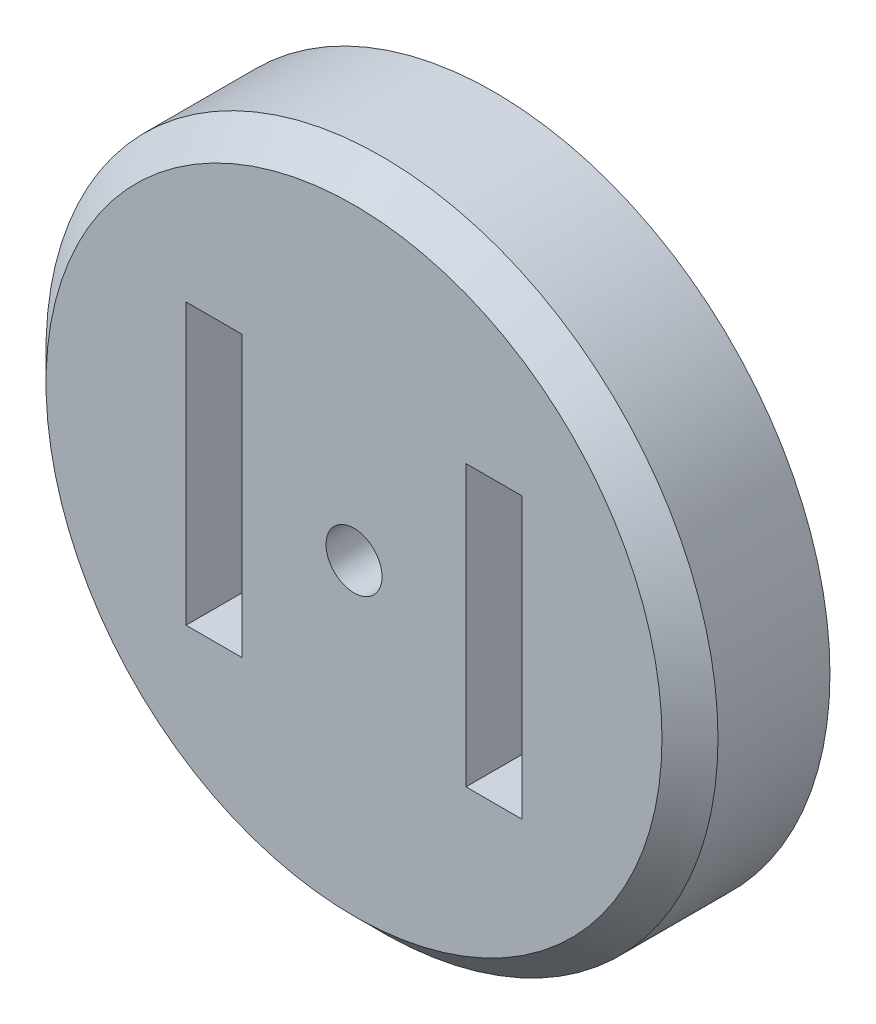
ISO-10303-21;
HEADER;
FILE_DESCRIPTION(('STEP AP214'),'2;1');
FILE_NAME('part.step','',(''),(''),'','','');
FILE_SCHEMA(('AUTOMOTIVE_DESIGN { 1 0 10303 214 1 1 1 1 }'));
ENDSEC;
DATA;
#1=APPLICATION_CONTEXT('core data for automotive mechanical design processes');
#2=APPLICATION_PROTOCOL_DEFINITION('international standard','automotive_design',2000,#1);
#3=PRODUCT_CONTEXT('',#1,'mechanical');
#4=PRODUCT('Part','Part','',(#3));
#5=PRODUCT_RELATED_PRODUCT_CATEGORY('part','',(#4));
#6=PRODUCT_DEFINITION_FORMATION('','',#4);
#7=PRODUCT_DEFINITION_CONTEXT('part definition',#1,'design');
#8=PRODUCT_DEFINITION('design','',#6,#7);
#9=PRODUCT_DEFINITION_SHAPE('','',#8);
#10=(LENGTH_UNIT() NAMED_UNIT(*) SI_UNIT(.MILLI.,.METRE.));
#11=(NAMED_UNIT(*) PLANE_ANGLE_UNIT() SI_UNIT($,.RADIAN.));
#12=(NAMED_UNIT(*) SI_UNIT($,.STERADIAN.) SOLID_ANGLE_UNIT());
#13=UNCERTAINTY_MEASURE_WITH_UNIT(LENGTH_MEASURE(1.E-05),#10,'distance_accuracy_value','');
#14=(GEOMETRIC_REPRESENTATION_CONTEXT(3) GLOBAL_UNCERTAINTY_ASSIGNED_CONTEXT((#13)) GLOBAL_UNIT_ASSIGNED_CONTEXT((#10,
#11,#12)) REPRESENTATION_CONTEXT('',''));
#15=CARTESIAN_POINT('',(0.,0.,0.));
#16=DIRECTION('',(0.,0.,1.));
#17=DIRECTION('',(1.,0.,0.));
#18=AXIS2_PLACEMENT_3D('',#15,#16,#17);
#19=CARTESIAN_POINT('',(0.,0.,0.));
#20=DIRECTION('',(0.,0.,1.));
#21=DIRECTION('',(1.,0.,0.));
#22=AXIS2_PLACEMENT_3D('',#19,#20,#21);
#23=CYLINDRICAL_SURFACE('',#22,5.);
#24=CARTESIAN_POINT('',(0.,0.,25.));
#25=DIRECTION('',(0.,0.,1.));
#26=DIRECTION('',(1.,0.,0.));
#27=AXIS2_PLACEMENT_3D('',#24,#25,#26);
#28=CIRCLE('',#27,5.);
#29=CARTESIAN_POINT('',(5.,0.,25.));
#30=VERTEX_POINT('',#29);
#31=EDGE_CURVE('E130',#30,#30,#28,.T.);
#32=ORIENTED_EDGE('',*,*,#31,.T.);
#33=EDGE_LOOP('',(#32));
#34=FACE_BOUND('',#33,.T.);
#35=CARTESIAN_POINT('',(0.,0.,4.));
#36=DIRECTION('',(0.,0.,-1.));
#37=DIRECTION('',(-1.,0.,0.));
#38=AXIS2_PLACEMENT_3D('',#35,#36,#37);
#39=CIRCLE('',#38,5.);
#40=CARTESIAN_POINT('',(-5.,0.,4.));
#41=VERTEX_POINT('',#40);
#42=EDGE_CURVE('E40',#41,#41,#39,.F.);
#43=ORIENTED_EDGE('',*,*,#42,.F.);
#44=EDGE_LOOP('',(#43));
#45=FACE_BOUND('',#44,.T.);
#46=ADVANCED_FACE('F35',(#34,#45),#23,.F.);
#47=CARTESIAN_POINT('',(0.,0.,25.));
#48=DIRECTION('',(0.,0.,-1.));
#49=DIRECTION('',(-1.,0.,0.));
#50=AXIS2_PLACEMENT_3D('',#47,#48,#49);
#51=CYLINDRICAL_SURFACE('',#50,60.);
#52=CARTESIAN_POINT('',(0.,0.,20.));
#53=DIRECTION('',(0.,0.,1.));
#54=DIRECTION('',(1.,0.,0.));
#55=AXIS2_PLACEMENT_3D('',#52,#53,#54);
#56=CIRCLE('',#55,60.);
#57=CARTESIAN_POINT('',(60.,0.,20.));
#58=VERTEX_POINT('',#57);
#59=EDGE_CURVE('E11',#58,#58,#56,.F.);
#60=ORIENTED_EDGE('',*,*,#59,.T.);
#61=EDGE_LOOP('',(#60));
#62=FACE_BOUND('',#61,.T.);
#63=CARTESIAN_POINT('',(0.,0.,0.));
#64=DIRECTION('',(0.,0.,1.));
#65=DIRECTION('',(1.,0.,0.));
#66=AXIS2_PLACEMENT_3D('',#63,#64,#65);
#67=CIRCLE('',#66,60.);
#68=CARTESIAN_POINT('',(60.,0.,0.));
#69=VERTEX_POINT('',#68);
#70=EDGE_CURVE('E174',#69,#69,#67,.T.);
#71=ORIENTED_EDGE('',*,*,#70,.T.);
#72=EDGE_LOOP('',(#71));
#73=FACE_BOUND('',#72,.T.);
#74=ADVANCED_FACE('F197',(#62,#73),#51,.T.);
#75=CARTESIAN_POINT('',(0.,0.,25.));
#76=DIRECTION('',(0.,0.,1.));
#77=DIRECTION('',(1.,0.,0.));
#78=AXIS2_PLACEMENT_3D('',#75,#76,#77);
#79=PLANE('',#78);
#80=ORIENTED_EDGE('',*,*,#31,.F.);
#81=EDGE_LOOP('',(#80));
#82=FACE_BOUND('',#81,.T.);
#83=CARTESIAN_POINT('',(0.,0.,25.));
#84=DIRECTION('',(0.,0.,1.));
#85=DIRECTION('',(1.,0.,0.));
#86=AXIS2_PLACEMENT_3D('',#83,#84,#85);
#87=CIRCLE('',#86,55.0000000000001);
#88=CARTESIAN_POINT('',(55.0000000000001,0.,25.));
#89=VERTEX_POINT('',#88);
#90=EDGE_CURVE('E45',#89,#89,#87,.T.);
#91=ORIENTED_EDGE('',*,*,#90,.T.);
#92=EDGE_LOOP('',(#91));
#93=FACE_BOUND('',#92,.T.);
#94=DIRECTION('',(0.,-1.,0.));
#95=VECTOR('',#94,1.);
#96=CARTESIAN_POINT('',(-30.,0.,25.));
#97=LINE('',#96,#95);
#98=CARTESIAN_POINT('',(-30.,25.,25.));
#99=VERTEX_POINT('',#98);
#100=CARTESIAN_POINT('',(-30.,-25.,25.));
#101=VERTEX_POINT('',#100);
#102=EDGE_CURVE('E107',#99,#101,#97,.T.);
#103=ORIENTED_EDGE('',*,*,#102,.F.);
#104=DIRECTION('',(-1.,0.,0.));
#105=VECTOR('',#104,1.);
#106=CARTESIAN_POINT('',(0.,25.,25.));
#107=LINE('',#106,#105);
#108=CARTESIAN_POINT('',(-20.,25.,25.));
#109=VERTEX_POINT('',#108);
#110=EDGE_CURVE('E171',#109,#99,#107,.T.);
#111=ORIENTED_EDGE('',*,*,#110,.F.);
#112=DIRECTION('',(0.,1.,0.));
#113=VECTOR('',#112,1.);
#114=CARTESIAN_POINT('',(-20.,0.,25.));
#115=LINE('',#114,#113);
#116=CARTESIAN_POINT('',(-20.,-25.,25.));
#117=VERTEX_POINT('',#116);
#118=EDGE_CURVE('E169',#117,#109,#115,.T.);
#119=ORIENTED_EDGE('',*,*,#118,.F.);
#120=DIRECTION('',(1.,0.,0.));
#121=VECTOR('',#120,1.);
#122=CARTESIAN_POINT('',(0.,-25.,25.));
#123=LINE('',#122,#121);
#124=EDGE_CURVE('E167',#101,#117,#123,.T.);
#125=ORIENTED_EDGE('',*,*,#124,.F.);
#126=EDGE_LOOP('',(#103,#111,#119,#125));
#127=FACE_BOUND('',#126,.T.);
#128=DIRECTION('',(-1.,0.,0.));
#129=VECTOR('',#128,1.);
#130=CARTESIAN_POINT('',(0.,25.,25.));
#131=LINE('',#130,#129);
#132=CARTESIAN_POINT('',(30.,25.,25.));
#133=VERTEX_POINT('',#132);
#134=CARTESIAN_POINT('',(20.,25.,25.));
#135=VERTEX_POINT('',#134);
#136=EDGE_CURVE('E165',#133,#135,#131,.T.);
#137=ORIENTED_EDGE('',*,*,#136,.F.);
#138=DIRECTION('',(0.,1.,0.));
#139=VECTOR('',#138,1.);
#140=CARTESIAN_POINT('',(30.,0.,25.));
#141=LINE('',#140,#139);
#142=CARTESIAN_POINT('',(30.,-25.,25.));
#143=VERTEX_POINT('',#142);
#144=EDGE_CURVE('E163',#143,#133,#141,.T.);
#145=ORIENTED_EDGE('',*,*,#144,.F.);
#146=DIRECTION('',(1.,0.,0.));
#147=VECTOR('',#146,1.);
#148=CARTESIAN_POINT('',(0.,-25.,25.));
#149=LINE('',#148,#147);
#150=CARTESIAN_POINT('',(20.,-25.,25.));
#151=VERTEX_POINT('',#150);
#152=EDGE_CURVE('E161',#151,#143,#149,.T.);
#153=ORIENTED_EDGE('',*,*,#152,.F.);
#154=DIRECTION('',(0.,-1.,0.));
#155=VECTOR('',#154,1.);
#156=CARTESIAN_POINT('',(20.,0.,25.));
#157=LINE('',#156,#155);
#158=EDGE_CURVE('E137',#135,#151,#157,.T.);
#159=ORIENTED_EDGE('',*,*,#158,.F.);
#160=EDGE_LOOP('',(#137,#145,#153,#159));
#161=FACE_BOUND('',#160,.T.);
#162=ADVANCED_FACE('F180',(#82,#93,#127,#161),#79,.T.);
#163=CARTESIAN_POINT('',(0.,0.,0.));
#164=DIRECTION('',(0.,0.,1.));
#165=DIRECTION('',(1.,0.,0.));
#166=AXIS2_PLACEMENT_3D('',#163,#164,#165);
#167=PLANE('',#166);
#168=CARTESIAN_POINT('',(0.,0.,0.));
#169=DIRECTION('',(0.,0.,-1.));
#170=DIRECTION('',(-1.,0.,0.));
#171=AXIS2_PLACEMENT_3D('',#168,#169,#170);
#172=CIRCLE('',#171,18.);
#173=CARTESIAN_POINT('',(-18.,0.,0.));
#174=VERTEX_POINT('',#173);
#175=EDGE_CURVE('E241',#174,#174,#172,.T.);
#176=ORIENTED_EDGE('',*,*,#175,.F.);
#177=EDGE_LOOP('',(#176));
#178=FACE_BOUND('',#177,.T.);
#179=DIRECTION('',(-1.,0.,0.));
#180=VECTOR('',#179,1.);
#181=CARTESIAN_POINT('',(-30.,25.,0.));
#182=LINE('',#181,#180);
#183=CARTESIAN_POINT('',(-20.,25.,0.));
#184=VERTEX_POINT('',#183);
#185=CARTESIAN_POINT('',(-30.,25.,0.));
#186=VERTEX_POINT('',#185);
#187=EDGE_CURVE('E110',#184,#186,#182,.T.);
#188=ORIENTED_EDGE('',*,*,#187,.T.);
#189=DIRECTION('',(0.,-1.,0.));
#190=VECTOR('',#189,1.);
#191=CARTESIAN_POINT('',(-30.,25.,0.));
#192=LINE('',#191,#190);
#193=CARTESIAN_POINT('',(-30.,-25.,0.));
#194=VERTEX_POINT('',#193);
#195=EDGE_CURVE('E104',#186,#194,#192,.T.);
#196=ORIENTED_EDGE('',*,*,#195,.T.);
#197=DIRECTION('',(1.,0.,0.));
#198=VECTOR('',#197,1.);
#199=CARTESIAN_POINT('',(-30.,-25.,0.));
#200=LINE('',#199,#198);
#201=CARTESIAN_POINT('',(-20.,-25.,0.));
#202=VERTEX_POINT('',#201);
#203=EDGE_CURVE('E114',#194,#202,#200,.T.);
#204=ORIENTED_EDGE('',*,*,#203,.T.);
#205=DIRECTION('',(0.,1.,0.));
#206=VECTOR('',#205,1.);
#207=CARTESIAN_POINT('',(-20.,25.,0.));
#208=LINE('',#207,#206);
#209=EDGE_CURVE('E119',#202,#184,#208,.T.);
#210=ORIENTED_EDGE('',*,*,#209,.T.);
#211=EDGE_LOOP('',(#188,#196,#204,#210));
#212=FACE_BOUND('',#211,.T.);
#213=DIRECTION('',(0.,1.,0.));
#214=VECTOR('',#213,1.);
#215=CARTESIAN_POINT('',(30.,25.,0.));
#216=LINE('',#215,#214);
#217=CARTESIAN_POINT('',(30.,-25.,0.));
#218=VERTEX_POINT('',#217);
#219=CARTESIAN_POINT('',(30.,25.,0.));
#220=VERTEX_POINT('',#219);
#221=EDGE_CURVE('E151',#218,#220,#216,.T.);
#222=ORIENTED_EDGE('',*,*,#221,.T.);
#223=DIRECTION('',(-1.,0.,0.));
#224=VECTOR('',#223,1.);
#225=CARTESIAN_POINT('',(30.,25.,0.));
#226=LINE('',#225,#224);
#227=CARTESIAN_POINT('',(20.,25.,0.));
#228=VERTEX_POINT('',#227);
#229=EDGE_CURVE('E142',#220,#228,#226,.T.);
#230=ORIENTED_EDGE('',*,*,#229,.T.);
#231=DIRECTION('',(0.,-1.,0.));
#232=VECTOR('',#231,1.);
#233=CARTESIAN_POINT('',(20.,25.,0.));
#234=LINE('',#233,#232);
#235=CARTESIAN_POINT('',(20.,-25.,0.));
#236=VERTEX_POINT('',#235);
#237=EDGE_CURVE('E145',#228,#236,#234,.T.);
#238=ORIENTED_EDGE('',*,*,#237,.T.);
#239=DIRECTION('',(1.,0.,0.));
#240=VECTOR('',#239,1.);
#241=CARTESIAN_POINT('',(30.,-25.,0.));
#242=LINE('',#241,#240);
#243=EDGE_CURVE('E148',#236,#218,#242,.T.);
#244=ORIENTED_EDGE('',*,*,#243,.T.);
#245=EDGE_LOOP('',(#222,#230,#238,#244));
#246=FACE_BOUND('',#245,.T.);
#247=ORIENTED_EDGE('',*,*,#70,.F.);
#248=EDGE_LOOP('',(#247));
#249=FACE_BOUND('',#248,.T.);
#250=ADVANCED_FACE('F121',(#178,#212,#246,#249),#167,.F.);
#251=CARTESIAN_POINT('',(30.,25.,0.));
#252=DIRECTION('',(0.,1.,0.));
#253=DIRECTION('',(0.,0.,1.));
#254=AXIS2_PLACEMENT_3D('',#251,#252,#253);
#255=PLANE('',#254);
#256=ORIENTED_EDGE('',*,*,#136,.T.);
#257=DIRECTION('',(0.,0.,1.));
#258=VECTOR('',#257,1.);
#259=CARTESIAN_POINT('',(20.,25.,0.));
#260=LINE('',#259,#258);
#261=EDGE_CURVE('E60',#228,#135,#260,.T.);
#262=ORIENTED_EDGE('',*,*,#261,.F.);
#263=ORIENTED_EDGE('',*,*,#229,.F.);
#264=DIRECTION('',(0.,0.,1.));
#265=VECTOR('',#264,1.);
#266=CARTESIAN_POINT('',(30.,25.,0.));
#267=LINE('',#266,#265);
#268=EDGE_CURVE('E124',#220,#133,#267,.T.);
#269=ORIENTED_EDGE('',*,*,#268,.T.);
#270=EDGE_LOOP('',(#256,#262,#263,#269));
#271=FACE_BOUND('',#270,.T.);
#272=ADVANCED_FACE('F222',(#271),#255,.F.);
#273=CARTESIAN_POINT('',(30.,25.,0.));
#274=DIRECTION('',(1.,0.,0.));
#275=DIRECTION('',(0.,0.,-1.));
#276=AXIS2_PLACEMENT_3D('',#273,#274,#275);
#277=PLANE('',#276);
#278=ORIENTED_EDGE('',*,*,#144,.T.);
#279=ORIENTED_EDGE('',*,*,#268,.F.);
#280=ORIENTED_EDGE('',*,*,#221,.F.);
#281=DIRECTION('',(0.,0.,1.));
#282=VECTOR('',#281,1.);
#283=CARTESIAN_POINT('',(30.,-25.,0.));
#284=LINE('',#283,#282);
#285=EDGE_CURVE('E127',#218,#143,#284,.T.);
#286=ORIENTED_EDGE('',*,*,#285,.T.);
#287=EDGE_LOOP('',(#278,#279,#280,#286));
#288=FACE_BOUND('',#287,.T.);
#289=ADVANCED_FACE('F218',(#288),#277,.F.);
#290=CARTESIAN_POINT('',(30.,-25.,0.));
#291=DIRECTION('',(0.,-1.,0.));
#292=DIRECTION('',(0.,0.,-1.));
#293=AXIS2_PLACEMENT_3D('',#290,#291,#292);
#294=PLANE('',#293);
#295=ORIENTED_EDGE('',*,*,#152,.T.);
#296=ORIENTED_EDGE('',*,*,#285,.F.);
#297=ORIENTED_EDGE('',*,*,#243,.F.);
#298=DIRECTION('',(0.,0.,1.));
#299=VECTOR('',#298,1.);
#300=CARTESIAN_POINT('',(20.,-25.,0.));
#301=LINE('',#300,#299);
#302=EDGE_CURVE('E156',#236,#151,#301,.T.);
#303=ORIENTED_EDGE('',*,*,#302,.T.);
#304=EDGE_LOOP('',(#295,#296,#297,#303));
#305=FACE_BOUND('',#304,.T.);
#306=ADVANCED_FACE('F221',(#305),#294,.F.);
#307=CARTESIAN_POINT('',(20.,25.,0.));
#308=DIRECTION('',(-1.,0.,0.));
#309=DIRECTION('',(0.,0.,1.));
#310=AXIS2_PLACEMENT_3D('',#307,#308,#309);
#311=PLANE('',#310);
#312=ORIENTED_EDGE('',*,*,#158,.T.);
#313=ORIENTED_EDGE('',*,*,#302,.F.);
#314=ORIENTED_EDGE('',*,*,#237,.F.);
#315=ORIENTED_EDGE('',*,*,#261,.T.);
#316=EDGE_LOOP('',(#312,#313,#314,#315));
#317=FACE_BOUND('',#316,.T.);
#318=ADVANCED_FACE('F217',(#317),#311,.F.);
#319=CARTESIAN_POINT('',(-30.,25.,0.));
#320=DIRECTION('',(-1.,0.,0.));
#321=DIRECTION('',(0.,0.,1.));
#322=AXIS2_PLACEMENT_3D('',#319,#320,#321);
#323=PLANE('',#322);
#324=ORIENTED_EDGE('',*,*,#102,.T.);
#325=DIRECTION('',(0.,0.,1.));
#326=VECTOR('',#325,1.);
#327=CARTESIAN_POINT('',(-30.,-25.,0.));
#328=LINE('',#327,#326);
#329=EDGE_CURVE('E52',#194,#101,#328,.T.);
#330=ORIENTED_EDGE('',*,*,#329,.F.);
#331=ORIENTED_EDGE('',*,*,#195,.F.);
#332=DIRECTION('',(0.,0.,1.));
#333=VECTOR('',#332,1.);
#334=CARTESIAN_POINT('',(-30.,25.,0.));
#335=LINE('',#334,#333);
#336=EDGE_CURVE('E135',#186,#99,#335,.T.);
#337=ORIENTED_EDGE('',*,*,#336,.T.);
#338=EDGE_LOOP('',(#324,#330,#331,#337));
#339=FACE_BOUND('',#338,.T.);
#340=ADVANCED_FACE('F101',(#339),#323,.F.);
#341=CARTESIAN_POINT('',(-30.,25.,0.));
#342=DIRECTION('',(0.,1.,0.));
#343=DIRECTION('',(0.,0.,1.));
#344=AXIS2_PLACEMENT_3D('',#341,#342,#343);
#345=PLANE('',#344);
#346=ORIENTED_EDGE('',*,*,#110,.T.);
#347=ORIENTED_EDGE('',*,*,#336,.F.);
#348=ORIENTED_EDGE('',*,*,#187,.F.);
#349=DIRECTION('',(0.,0.,1.));
#350=VECTOR('',#349,1.);
#351=CARTESIAN_POINT('',(-20.,25.,0.));
#352=LINE('',#351,#350);
#353=EDGE_CURVE('E138',#184,#109,#352,.T.);
#354=ORIENTED_EDGE('',*,*,#353,.T.);
#355=EDGE_LOOP('',(#346,#347,#348,#354));
#356=FACE_BOUND('',#355,.T.);
#357=ADVANCED_FACE('F208',(#356),#345,.F.);
#358=CARTESIAN_POINT('',(-20.,25.,0.));
#359=DIRECTION('',(1.,0.,0.));
#360=DIRECTION('',(0.,0.,-1.));
#361=AXIS2_PLACEMENT_3D('',#358,#359,#360);
#362=PLANE('',#361);
#363=ORIENTED_EDGE('',*,*,#118,.T.);
#364=ORIENTED_EDGE('',*,*,#353,.F.);
#365=ORIENTED_EDGE('',*,*,#209,.F.);
#366=DIRECTION('',(0.,0.,1.));
#367=VECTOR('',#366,1.);
#368=CARTESIAN_POINT('',(-20.,-25.,0.));
#369=LINE('',#368,#367);
#370=EDGE_CURVE('E109',#202,#117,#369,.T.);
#371=ORIENTED_EDGE('',*,*,#370,.T.);
#372=EDGE_LOOP('',(#363,#364,#365,#371));
#373=FACE_BOUND('',#372,.T.);
#374=ADVANCED_FACE('F193',(#373),#362,.F.);
#375=CARTESIAN_POINT('',(-30.,-25.,0.));
#376=DIRECTION('',(0.,-1.,0.));
#377=DIRECTION('',(0.,0.,-1.));
#378=AXIS2_PLACEMENT_3D('',#375,#376,#377);
#379=PLANE('',#378);
#380=ORIENTED_EDGE('',*,*,#124,.T.);
#381=ORIENTED_EDGE('',*,*,#370,.F.);
#382=ORIENTED_EDGE('',*,*,#203,.F.);
#383=ORIENTED_EDGE('',*,*,#329,.T.);
#384=EDGE_LOOP('',(#380,#381,#382,#383));
#385=FACE_BOUND('',#384,.T.);
#386=ADVANCED_FACE('F115',(#385),#379,.F.);
#387=CARTESIAN_POINT('',(0.,0.,25.));
#388=DIRECTION('',(0.,0.,-1.));
#389=DIRECTION('',(-1.,0.,0.));
#390=AXIS2_PLACEMENT_3D('',#387,#388,#389);
#391=CONICAL_SURFACE('',#390,55.0000000000001,0.785398163397443);
#392=ORIENTED_EDGE('',*,*,#59,.F.);
#393=EDGE_LOOP('',(#392));
#394=FACE_BOUND('',#393,.T.);
#395=ORIENTED_EDGE('',*,*,#90,.F.);
#396=EDGE_LOOP('',(#395));
#397=FACE_BOUND('',#396,.T.);
#398=ADVANCED_FACE('F38',(#394,#397),#391,.T.);
#399=CARTESIAN_POINT('',(0.,0.,4.));
#400=DIRECTION('',(0.,0.,-1.));
#401=DIRECTION('',(-1.,0.,0.));
#402=AXIS2_PLACEMENT_3D('',#399,#400,#401);
#403=PLANE('',#402);
#404=CARTESIAN_POINT('',(0.,0.,4.));
#405=DIRECTION('',(0.,0.,-1.));
#406=DIRECTION('',(-1.,0.,0.));
#407=AXIS2_PLACEMENT_3D('',#404,#405,#406);
#408=CIRCLE('',#407,18.);
#409=CARTESIAN_POINT('',(-18.,0.,4.));
#410=VERTEX_POINT('',#409);
#411=EDGE_CURVE('E243',#410,#410,#408,.T.);
#412=ORIENTED_EDGE('',*,*,#411,.T.);
#413=EDGE_LOOP('',(#412));
#414=FACE_BOUND('',#413,.T.);
#415=ORIENTED_EDGE('',*,*,#42,.T.);
#416=EDGE_LOOP('',(#415));
#417=FACE_BOUND('',#416,.T.);
#418=ADVANCED_FACE('F184',(#414,#417),#403,.T.);
#419=CARTESIAN_POINT('',(0.,0.,4.));
#420=DIRECTION('',(0.,0.,-1.));
#421=DIRECTION('',(-1.,0.,0.));
#422=AXIS2_PLACEMENT_3D('',#419,#420,#421);
#423=CYLINDRICAL_SURFACE('',#422,18.);
#424=ORIENTED_EDGE('',*,*,#411,.F.);
#425=EDGE_LOOP('',(#424));
#426=FACE_BOUND('',#425,.T.);
#427=ORIENTED_EDGE('',*,*,#175,.T.);
#428=EDGE_LOOP('',(#427));
#429=FACE_BOUND('',#428,.T.);
#430=ADVANCED_FACE('F190',(#426,#429),#423,.F.);
#431=CLOSED_SHELL('',(#46,#74,#162,#250,#272,#289,#306,#318,#340,#357,#374,#386,#398,#418,#430));
#432=MANIFOLD_SOLID_BREP('B2',#431);
#433=ADVANCED_BREP_SHAPE_REPRESENTATION('',(#18,#432),#14);
#434=SHAPE_DEFINITION_REPRESENTATION(#9,#433);
ENDSEC;
END-ISO-10303-21;
